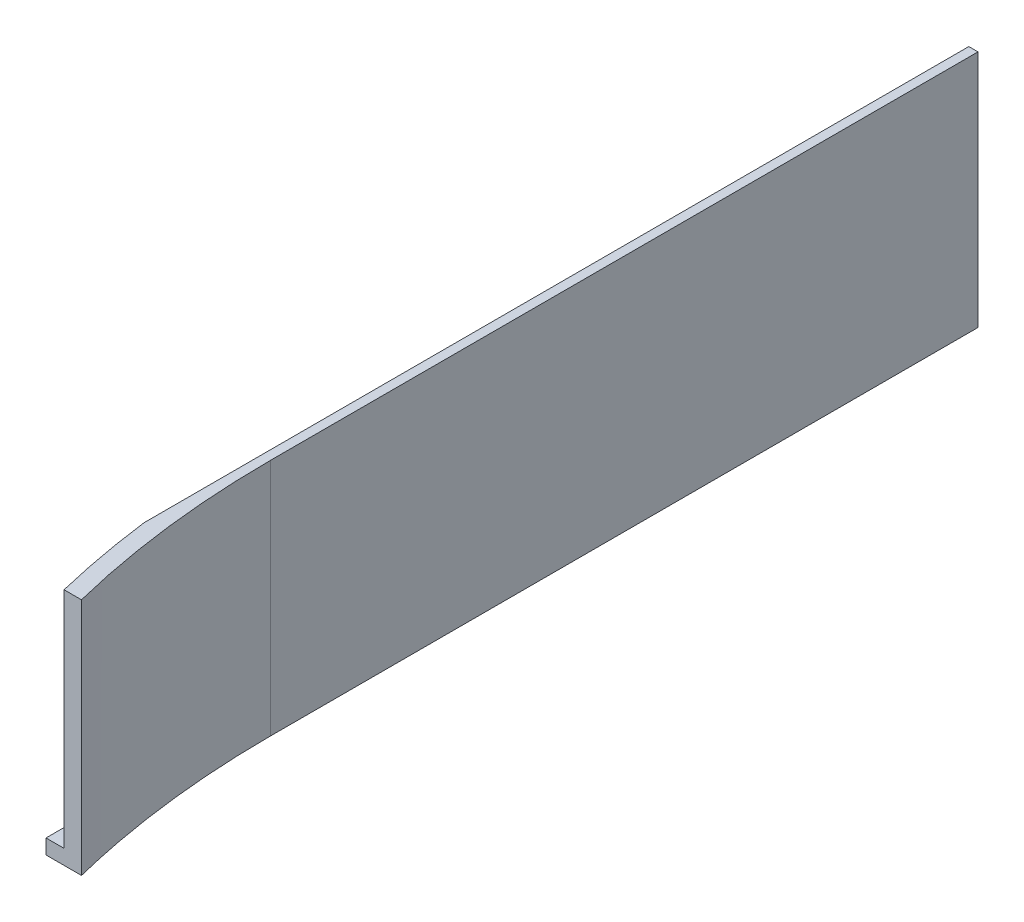
ISO-10303-21;
HEADER;
FILE_DESCRIPTION(('STEP AP214'),'2;1');
FILE_NAME('part.step','',(''),(''),'','','');
FILE_SCHEMA(('AUTOMOTIVE_DESIGN { 1 0 10303 214 1 1 1 1 }'));
ENDSEC;
DATA;
#1=APPLICATION_CONTEXT('core data for automotive mechanical design processes');
#2=APPLICATION_PROTOCOL_DEFINITION('international standard','automotive_design',2000,#1);
#3=PRODUCT_CONTEXT('',#1,'mechanical');
#4=PRODUCT('Part','Part','',(#3));
#5=PRODUCT_RELATED_PRODUCT_CATEGORY('part','',(#4));
#6=PRODUCT_DEFINITION_FORMATION('','',#4);
#7=PRODUCT_DEFINITION_CONTEXT('part definition',#1,'design');
#8=PRODUCT_DEFINITION('design','',#6,#7);
#9=PRODUCT_DEFINITION_SHAPE('','',#8);
#10=(LENGTH_UNIT() NAMED_UNIT(*) SI_UNIT(.MILLI.,.METRE.));
#11=(NAMED_UNIT(*) PLANE_ANGLE_UNIT() SI_UNIT($,.RADIAN.));
#12=(NAMED_UNIT(*) SI_UNIT($,.STERADIAN.) SOLID_ANGLE_UNIT());
#13=UNCERTAINTY_MEASURE_WITH_UNIT(LENGTH_MEASURE(1.E-05),#10,'distance_accuracy_value','');
#14=(GEOMETRIC_REPRESENTATION_CONTEXT(3) GLOBAL_UNCERTAINTY_ASSIGNED_CONTEXT((#13)) GLOBAL_UNIT_ASSIGNED_CONTEXT((#10,
#11,#12)) REPRESENTATION_CONTEXT('',''));
#15=CARTESIAN_POINT('',(0.,0.,0.));
#16=DIRECTION('',(0.,0.,1.));
#17=DIRECTION('',(1.,0.,0.));
#18=AXIS2_PLACEMENT_3D('',#15,#16,#17);
#19=CARTESIAN_POINT('',(-300.,0.,0.));
#20=DIRECTION('',(1.,0.,0.));
#21=DIRECTION('',(0.,0.,-1.));
#22=AXIS2_PLACEMENT_3D('',#19,#20,#21);
#23=PLANE('',#22);
#24=DIRECTION('',(0.,-1.,0.));
#25=VECTOR('',#24,1.);
#26=CARTESIAN_POINT('',(-300.,0.,150.));
#27=LINE('',#26,#25);
#28=CARTESIAN_POINT('',(-300.,80.1625120885842,149.999999999977));
#29=VERTEX_POINT('',#28);
#30=CARTESIAN_POINT('',(-300.,77.7625120885841,149.999999999977));
#31=VERTEX_POINT('',#30);
#32=EDGE_CURVE('E11',#29,#31,#27,.T.);
#33=ORIENTED_EDGE('',*,*,#32,.F.);
#34=DIRECTION('',(0.,0.,-1.));
#35=VECTOR('',#34,1.);
#36=CARTESIAN_POINT('',(-300.,80.1625120885842,-208.339640738144));
#37=LINE('',#36,#35);
#38=CARTESIAN_POINT('',(-300.,80.1625120885842,134.047260122252));
#39=VERTEX_POINT('',#38);
#40=EDGE_CURVE('E115',#29,#39,#37,.T.);
#41=ORIENTED_EDGE('',*,*,#40,.T.);
#42=DIRECTION('',(0.,-1.,0.));
#43=VECTOR('',#42,1.);
#44=CARTESIAN_POINT('',(-300.,103.299199319842,134.047260122252));
#45=LINE('',#44,#43);
#46=CARTESIAN_POINT('',(-300.,116.56754481445,134.047260122252));
#47=VERTEX_POINT('',#46);
#48=EDGE_CURVE('E212',#47,#39,#45,.T.);
#49=ORIENTED_EDGE('',*,*,#48,.F.);
#50=DIRECTION('',(0.,0.,1.));
#51=VECTOR('',#50,1.);
#52=CARTESIAN_POINT('',(-300.,116.56754481445,230.000026632189));
#53=LINE('',#52,#51);
#54=CARTESIAN_POINT('',(-300.,116.56754481445,0.));
#55=VERTEX_POINT('',#54);
#56=EDGE_CURVE('E102',#55,#47,#53,.T.);
#57=ORIENTED_EDGE('',*,*,#56,.F.);
#58=DIRECTION('',(0.,-1.,0.));
#59=VECTOR('',#58,1.);
#60=CARTESIAN_POINT('',(-300.,0.,0.));
#61=LINE('',#60,#59);
#62=CARTESIAN_POINT('',(-300.,77.7625120885841,0.));
#63=VERTEX_POINT('',#62);
#64=EDGE_CURVE('E39',#55,#63,#61,.T.);
#65=ORIENTED_EDGE('',*,*,#64,.T.);
#66=DIRECTION('',(0.,0.,-1.));
#67=VECTOR('',#66,1.);
#68=CARTESIAN_POINT('',(-300.,77.7625120885841,-149.499973367811));
#69=LINE('',#68,#67);
#70=EDGE_CURVE('E206',#31,#63,#69,.T.);
#71=ORIENTED_EDGE('',*,*,#70,.F.);
#72=EDGE_LOOP('',(#33,#41,#49,#57,#65,#71));
#73=FACE_BOUND('',#72,.T.);
#74=ADVANCED_FACE('F34',(#73),#23,.F.);
#75=CARTESIAN_POINT('',(0.,0.,0.));
#76=DIRECTION('',(0.,0.,1.));
#77=DIRECTION('',(1.,0.,0.));
#78=AXIS2_PLACEMENT_3D('',#75,#76,#77);
#79=PLANE('',#78);
#80=ORIENTED_EDGE('',*,*,#64,.F.);
#81=DIRECTION('',(-1.,0.,0.));
#82=VECTOR('',#81,1.);
#83=CARTESIAN_POINT('',(-253.506364446809,116.56754481445,0.));
#84=LINE('',#83,#82);
#85=CARTESIAN_POINT('',(-298.506364446809,116.56754481445,0.));
#86=VERTEX_POINT('',#85);
#87=EDGE_CURVE('E163',#86,#55,#84,.T.);
#88=ORIENTED_EDGE('',*,*,#87,.F.);
#89=DIRECTION('',(0.,-1.,0.));
#90=VECTOR('',#89,1.);
#91=CARTESIAN_POINT('',(-298.506364446809,329.118910613293,0.));
#92=LINE('',#91,#90);
#93=CARTESIAN_POINT('',(-298.506364446809,77.7625120885841,0.));
#94=VERTEX_POINT('',#93);
#95=EDGE_CURVE('E124',#86,#94,#92,.T.);
#96=ORIENTED_EDGE('',*,*,#95,.T.);
#97=DIRECTION('',(1.,0.,0.));
#98=VECTOR('',#97,1.);
#99=CARTESIAN_POINT('',(-308.554799780113,77.7625120885841,0.));
#100=LINE('',#99,#98);
#101=EDGE_CURVE('E127',#63,#94,#100,.T.);
#102=ORIENTED_EDGE('',*,*,#101,.F.);
#103=EDGE_LOOP('',(#80,#88,#96,#102));
#104=FACE_BOUND('',#103,.T.);
#105=ADVANCED_FACE('F183',(#104),#79,.F.);
#106=CARTESIAN_POINT('',(1.11022302462516E-13,0.,150.));
#107=DIRECTION('',(0.,0.,1.));
#108=DIRECTION('',(1.,0.,0.));
#109=AXIS2_PLACEMENT_3D('',#106,#107,#108);
#110=PLANE('',#109);
#111=ORIENTED_EDGE('',*,*,#32,.T.);
#112=DIRECTION('',(1.,0.,0.));
#113=VECTOR('',#112,1.);
#114=CARTESIAN_POINT('',(-308.554799780113,77.7625120885841,150.));
#115=LINE('',#114,#113);
#116=CARTESIAN_POINT('',(-294.23685836779,77.7625120885841,150.));
#117=VERTEX_POINT('',#116);
#118=EDGE_CURVE('E125',#31,#117,#115,.T.);
#119=ORIENTED_EDGE('',*,*,#118,.T.);
#120=DIRECTION('',(0.,-1.,0.));
#121=VECTOR('',#120,1.);
#122=CARTESIAN_POINT('',(-294.23685836779,102.739630130056,150.));
#123=LINE('',#122,#121);
#124=CARTESIAN_POINT('',(-294.236858367791,116.56754481445,149.999999999997));
#125=VERTEX_POINT('',#124);
#126=EDGE_CURVE('E114',#125,#117,#123,.T.);
#127=ORIENTED_EDGE('',*,*,#126,.F.);
#128=DIRECTION('',(-1.,0.,0.));
#129=VECTOR('',#128,1.);
#130=CARTESIAN_POINT('',(-253.506364446809,116.56754481445,150.));
#131=LINE('',#130,#129);
#132=CARTESIAN_POINT('',(-297.067120924695,116.56754481445,150.));
#133=VERTEX_POINT('',#132);
#134=EDGE_CURVE('E99',#125,#133,#131,.T.);
#135=ORIENTED_EDGE('',*,*,#134,.T.);
#136=DIRECTION('',(0.,-1.,0.));
#137=VECTOR('',#136,1.);
#138=CARTESIAN_POINT('',(-297.067120924695,103.299199319842,150.));
#139=LINE('',#138,#137);
#140=CARTESIAN_POINT('',(-297.067120924695,80.1625120885842,150.));
#141=VERTEX_POINT('',#140);
#142=EDGE_CURVE('E112',#133,#141,#139,.T.);
#143=ORIENTED_EDGE('',*,*,#142,.T.);
#144=DIRECTION('',(1.,0.,0.));
#145=VECTOR('',#144,1.);
#146=CARTESIAN_POINT('',(-262.506364446809,80.1625120885842,150.));
#147=LINE('',#146,#145);
#148=EDGE_CURVE('E201',#29,#141,#147,.T.);
#149=ORIENTED_EDGE('',*,*,#148,.F.);
#150=EDGE_LOOP('',(#111,#119,#127,#135,#143,#149));
#151=FACE_BOUND('',#150,.T.);
#152=ADVANCED_FACE('F110',(#151),#110,.T.);
#153=CARTESIAN_POINT('',(-298.506364446809,329.118910613293,-114.999973367811));
#154=DIRECTION('',(1.,0.,0.));
#155=DIRECTION('',(0.,0.,-1.));
#156=AXIS2_PLACEMENT_3D('',#153,#154,#155);
#157=PLANE('',#156);
#158=ORIENTED_EDGE('',*,*,#95,.F.);
#159=DIRECTION('',(0.,0.,-1.));
#160=VECTOR('',#159,1.);
#161=CARTESIAN_POINT('',(-298.506364446809,116.56754481445,-114.999973367811));
#162=LINE('',#161,#160);
#163=CARTESIAN_POINT('',(-298.506364446809,116.56754481445,115.000026632189));
#164=VERTEX_POINT('',#163);
#165=EDGE_CURVE('E44',#164,#86,#162,.T.);
#166=ORIENTED_EDGE('',*,*,#165,.F.);
#167=DIRECTION('',(0.,-1.,0.));
#168=VECTOR('',#167,1.);
#169=CARTESIAN_POINT('',(-298.506364446809,329.118910613293,115.000026632189));
#170=LINE('',#169,#168);
#171=CARTESIAN_POINT('',(-298.506364446809,77.7625120885841,115.000026632189));
#172=VERTEX_POINT('',#171);
#173=EDGE_CURVE('E132',#164,#172,#170,.T.);
#174=ORIENTED_EDGE('',*,*,#173,.T.);
#175=DIRECTION('',(0.,0.,-1.));
#176=VECTOR('',#175,1.);
#177=CARTESIAN_POINT('',(-298.506364446809,77.7625120885841,-149.499973367811));
#178=LINE('',#177,#176);
#179=EDGE_CURVE('E131',#172,#94,#178,.T.);
#180=ORIENTED_EDGE('',*,*,#179,.T.);
#181=EDGE_LOOP('',(#158,#166,#174,#180));
#182=FACE_BOUND('',#181,.T.);
#183=ADVANCED_FACE('F179',(#182),#157,.T.);
#184=CARTESIAN_POINT('',(-308.554799780113,77.7625120885841,-149.499973367811));
#185=DIRECTION('',(0.,1.,0.));
#186=DIRECTION('',(-1.,0.,0.));
#187=AXIS2_PLACEMENT_3D('',#184,#185,#186);
#188=PLANE('',#187);
#189=ORIENTED_EDGE('',*,*,#118,.F.);
#190=ORIENTED_EDGE('',*,*,#70,.T.);
#191=ORIENTED_EDGE('',*,*,#101,.T.);
#192=ORIENTED_EDGE('',*,*,#179,.F.);
#193=CARTESIAN_POINT('',(-298.506364446809,77.7625120885841,115.000026632189));
#194=CARTESIAN_POINT('',(-298.506364446809,77.7625120885841,152.726290705429));
#195=CARTESIAN_POINT('',(-285.043285040561,77.7625120885842,186.30208344604));
#196=CARTESIAN_POINT('',(-261.079419288202,77.7625120885842,208.339694002522));
#197=(BOUNDED_CURVE() B_SPLINE_CURVE(3,(#193,#194,#195,#196),.UNSPECIFIED.,.F.,
.F.) B_SPLINE_CURVE_WITH_KNOTS((4,4),(0.,1.),
.UNSPECIFIED.) CURVE() GEOMETRIC_REPRESENTATION_ITEM() RATIONAL_B_SPLINE_CURVE((1.,
0.92665637702562,0.92665637702562,1.)) REPRESENTATION_ITEM(''));
#198=EDGE_CURVE('E60',#117,#172,#197,.F.);
#199=ORIENTED_EDGE('',*,*,#198,.F.);
#200=EDGE_LOOP('',(#189,#190,#191,#192,#199));
#201=FACE_BOUND('',#200,.T.);
#202=ADVANCED_FACE('F175',(#201),#188,.F.);
#203=CARTESIAN_POINT('',(-262.506364446809,80.1625120885842,-208.339640738144));
#204=DIRECTION('',(0.,1.,0.));
#205=DIRECTION('',(0.,0.,1.));
#206=AXIS2_PLACEMENT_3D('',#203,#204,#205);
#207=PLANE('',#206);
#208=ORIENTED_EDGE('',*,*,#40,.F.);
#209=ORIENTED_EDGE('',*,*,#148,.T.);
#210=CARTESIAN_POINT('',(-301.206364446809,80.1625120885842,115.000026632189));
#211=CARTESIAN_POINT('',(-301.206364446809,80.1625120885842,152.858390441393));
#212=CARTESIAN_POINT('',(-287.995393539431,80.1625120885842,186.744939138622));
#213=CARTESIAN_POINT('',(-264.345443359509,80.1625120885842,209.549428504834));
#214=(BOUNDED_CURVE() B_SPLINE_CURVE(3,(#210,#211,#212,#213),.UNSPECIFIED.,.F.,
.F.) B_SPLINE_CURVE_WITH_KNOTS((4,4),(0.,1.),
.UNSPECIFIED.) CURVE() GEOMETRIC_REPRESENTATION_ITEM() RATIONAL_B_SPLINE_CURVE((1.,
0.930058341806268,0.930058341806268,1.)) REPRESENTATION_ITEM(''));
#215=EDGE_CURVE('E106',#141,#39,#214,.F.);
#216=ORIENTED_EDGE('',*,*,#215,.T.);
#217=EDGE_LOOP('',(#208,#209,#216));
#218=FACE_BOUND('',#217,.T.);
#219=ADVANCED_FACE('F172',(#218),#207,.T.);
#220=CARTESIAN_POINT('',(-253.506364446809,116.56754481445,230.000026632189));
#221=DIRECTION('',(0.,-1.,0.));
#222=DIRECTION('',(1.,0.,0.));
#223=AXIS2_PLACEMENT_3D('',#220,#221,#222);
#224=PLANE('',#223);
#225=ORIENTED_EDGE('',*,*,#134,.F.);
#226=CARTESIAN_POINT('',(-253.506364446809,116.56754481445,214.592948067399));
#227=CARTESIAN_POINT('',(-282.035221276509,116.56754481445,193.546487349794));
#228=CARTESIAN_POINT('',(-298.506364446809,116.56754481445,157.092948067399));
#229=CARTESIAN_POINT('',(-298.506364446809,116.56754481445,115.000026632189));
#230=(BOUNDED_CURVE() B_SPLINE_CURVE(3,(#226,#227,#228,#229),.UNSPECIFIED.,.F.,
.F.) B_SPLINE_CURVE_WITH_KNOTS((4,4),(0.,1.),
.UNSPECIFIED.) CURVE() GEOMETRIC_REPRESENTATION_ITEM() RATIONAL_B_SPLINE_CURVE((1.,
0.910683602522959,0.910683602522959,1.)) REPRESENTATION_ITEM(''));
#231=EDGE_CURVE('E52',#125,#164,#230,.T.);
#232=ORIENTED_EDGE('',*,*,#231,.T.);
#233=ORIENTED_EDGE('',*,*,#165,.T.);
#234=ORIENTED_EDGE('',*,*,#87,.T.);
#235=ORIENTED_EDGE('',*,*,#56,.T.);
#236=CARTESIAN_POINT('',(-253.506364446809,116.56754481445,218.557510668834));
#237=CARTESIAN_POINT('',(-283.692922793391,116.56754481445,197.140675916656));
#238=CARTESIAN_POINT('',(-301.206364446809,116.56754481445,159.118706221675));
#239=CARTESIAN_POINT('',(-301.206364446809,116.56754481445,115.000026632189));
#240=(BOUNDED_CURVE() B_SPLINE_CURVE(3,(#236,#237,#238,#239),.UNSPECIFIED.,.F.,
.F.) B_SPLINE_CURVE_WITH_KNOTS((4,4),(0.,1.),
.UNSPECIFIED.) CURVE() GEOMETRIC_REPRESENTATION_ITEM() RATIONAL_B_SPLINE_CURVE((1.,
0.907874095489197,0.907874095489197,1.)) REPRESENTATION_ITEM(''));
#241=EDGE_CURVE('E96',#133,#47,#240,.T.);
#242=ORIENTED_EDGE('',*,*,#241,.F.);
#243=EDGE_LOOP('',(#225,#232,#233,#234,#235,#242));
#244=FACE_BOUND('',#243,.T.);
#245=ADVANCED_FACE('F98',(#244),#224,.F.);
#246=CARTESIAN_POINT('',(-208.506364446809,329.118910613293,-3.44997336781099));
#247=CARTESIAN_POINT('',(-23.1063644468094,329.118910613293,-3.449973367811));
#248=CARTESIAN_POINT('',(-23.1063644468094,329.118910613293,233.450026632189));
#249=CARTESIAN_POINT('',(-208.506364446809,329.118910613293,233.450026632189));
#250=CARTESIAN_POINT('',(-393.906364446809,329.118910613293,233.450026632189));
#251=CARTESIAN_POINT('',(-393.906364446809,329.118910613293,-3.44997336781101));
#252=CARTESIAN_POINT('',(-208.506364446809,329.118910613293,-3.44997336781099));
#253=(BOUNDED_CURVE() B_SPLINE_CURVE(3,(#246,#247,#248,#249,#250,#251,#252),.UNSPECIFIED.,.T.,
.F.) B_SPLINE_CURVE_WITH_KNOTS((4,3,4),(0.,0.5,1.),
.UNSPECIFIED.) CURVE() GEOMETRIC_REPRESENTATION_ITEM() RATIONAL_B_SPLINE_CURVE((1.,
0.333333333333333,0.333333333333333,1.,0.333333333333333,0.333333333333333,1.)) REPRESENTATION_ITEM(''));
#254=DIRECTION('',(0.,-1.,0.));
#255=VECTOR('',#254,1.);
#256=SURFACE_OF_LINEAR_EXTRUSION('',#253,#255);
#257=ORIENTED_EDGE('',*,*,#142,.F.);
#258=ORIENTED_EDGE('',*,*,#241,.T.);
#259=ORIENTED_EDGE('',*,*,#48,.T.);
#260=ORIENTED_EDGE('',*,*,#215,.F.);
#261=EDGE_LOOP('',(#257,#258,#259,#260));
#262=FACE_BOUND('',#261,.T.);
#263=ADVANCED_FACE('F117',(#262),#256,.T.);
#264=CARTESIAN_POINT('',(-208.506364446809,329.118910613293,2.66321889957899E-05));
#265=CARTESIAN_POINT('',(-28.5063644468094,329.118910613293,2.66321890061982E-05));
#266=CARTESIAN_POINT('',(-28.5063644468094,329.118910613293,230.000026632189));
#267=CARTESIAN_POINT('',(-208.506364446809,329.118910613293,230.000026632189));
#268=CARTESIAN_POINT('',(-388.506364446809,329.118910613293,230.000026632189));
#269=CARTESIAN_POINT('',(-388.506364446809,329.118910613293,2.66321889957899E-05));
#270=CARTESIAN_POINT('',(-208.506364446809,329.118910613293,2.66321889957899E-05));
#271=(BOUNDED_CURVE() B_SPLINE_CURVE(3,(#264,#265,#266,#267,#268,#269,#270),.UNSPECIFIED.,.T.,
.F.) B_SPLINE_CURVE_WITH_KNOTS((4,3,4),(0.,0.5,1.),
.UNSPECIFIED.) CURVE() GEOMETRIC_REPRESENTATION_ITEM() RATIONAL_B_SPLINE_CURVE((1.,
0.333333333333333,0.333333333333333,1.,0.333333333333333,0.333333333333333,1.)) REPRESENTATION_ITEM(''));
#272=DIRECTION('',(0.,-1.,0.));
#273=VECTOR('',#272,1.);
#274=SURFACE_OF_LINEAR_EXTRUSION('',#271,#273);
#275=ORIENTED_EDGE('',*,*,#231,.F.);
#276=ORIENTED_EDGE('',*,*,#126,.T.);
#277=ORIENTED_EDGE('',*,*,#198,.T.);
#278=ORIENTED_EDGE('',*,*,#173,.F.);
#279=EDGE_LOOP('',(#275,#276,#277,#278));
#280=FACE_BOUND('',#279,.T.);
#281=ADVANCED_FACE('F36',(#280),#274,.F.);
#282=CLOSED_SHELL('',(#74,#105,#152,#183,#202,#219,#245,#263,#281));
#283=MANIFOLD_SOLID_BREP('B2',#282);
#284=ADVANCED_BREP_SHAPE_REPRESENTATION('',(#18,#283),#14);
#285=SHAPE_DEFINITION_REPRESENTATION(#9,#284);
ENDSEC;
END-ISO-10303-21;
